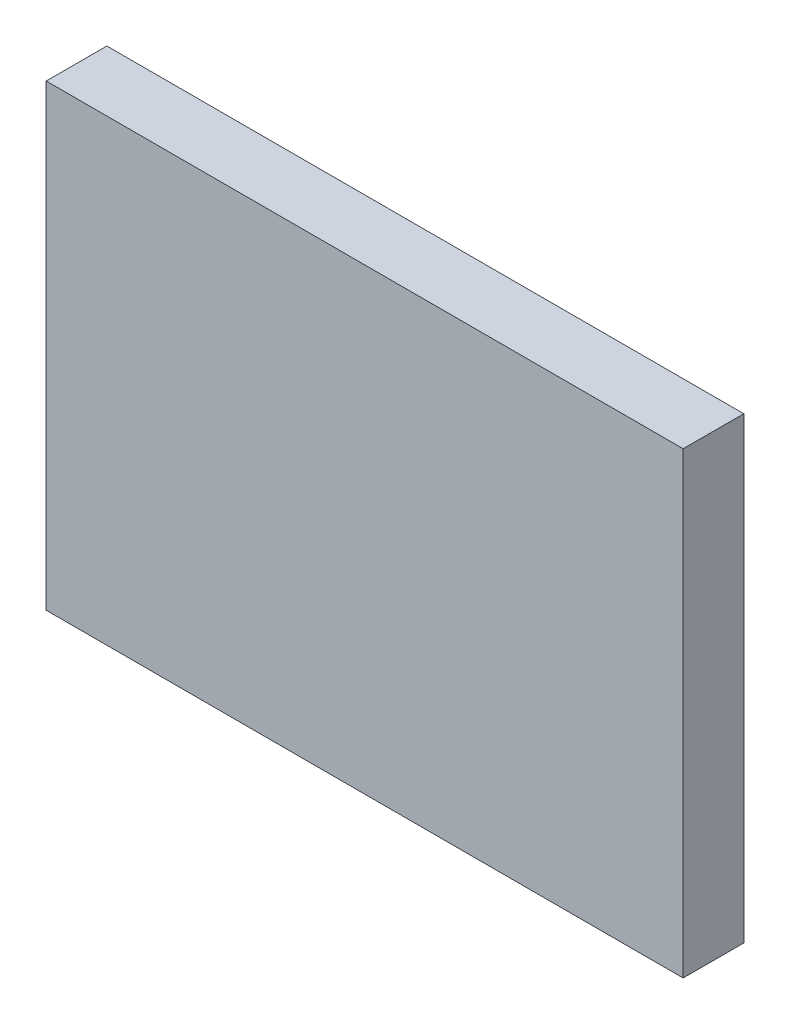
ISO-10303-21;
HEADER;
FILE_DESCRIPTION(('STEP AP214'),'2;1');
FILE_NAME('part.step','',(''),(''),'','','');
FILE_SCHEMA(('AUTOMOTIVE_DESIGN { 1 0 10303 214 1 1 1 1 }'));
ENDSEC;
DATA;
#1=APPLICATION_CONTEXT('core data for automotive mechanical design processes');
#2=APPLICATION_PROTOCOL_DEFINITION('international standard','automotive_design',2000,#1);
#3=PRODUCT_CONTEXT('',#1,'mechanical');
#4=PRODUCT('Part','Part','',(#3));
#5=PRODUCT_RELATED_PRODUCT_CATEGORY('part','',(#4));
#6=PRODUCT_DEFINITION_FORMATION('','',#4);
#7=PRODUCT_DEFINITION_CONTEXT('part definition',#1,'design');
#8=PRODUCT_DEFINITION('design','',#6,#7);
#9=PRODUCT_DEFINITION_SHAPE('','',#8);
#10=(LENGTH_UNIT() NAMED_UNIT(*) SI_UNIT(.MILLI.,.METRE.));
#11=(NAMED_UNIT(*) PLANE_ANGLE_UNIT() SI_UNIT($,.RADIAN.));
#12=(NAMED_UNIT(*) SI_UNIT($,.STERADIAN.) SOLID_ANGLE_UNIT());
#13=UNCERTAINTY_MEASURE_WITH_UNIT(LENGTH_MEASURE(1.E-05),#10,'distance_accuracy_value','');
#14=(GEOMETRIC_REPRESENTATION_CONTEXT(3) GLOBAL_UNCERTAINTY_ASSIGNED_CONTEXT((#13)) GLOBAL_UNIT_ASSIGNED_CONTEXT((#10,
#11,#12)) REPRESENTATION_CONTEXT('',''));
#15=CARTESIAN_POINT('',(0.,0.,0.));
#16=DIRECTION('',(0.,0.,1.));
#17=DIRECTION('',(1.,0.,0.));
#18=AXIS2_PLACEMENT_3D('',#15,#16,#17);
#19=CARTESIAN_POINT('',(0.,0.,6.35));
#20=DIRECTION('',(0.,1.,0.));
#21=DIRECTION('',(0.,0.,1.));
#22=AXIS2_PLACEMENT_3D('',#19,#20,#21);
#23=PLANE('',#22);
#24=DIRECTION('',(1.,0.,0.));
#25=VECTOR('',#24,1.);
#26=CARTESIAN_POINT('',(0.,0.,0.));
#27=LINE('',#26,#25);
#28=CARTESIAN_POINT('',(0.,0.,0.));
#29=VERTEX_POINT('',#28);
#30=CARTESIAN_POINT('',(66.7,0.,0.));
#31=VERTEX_POINT('',#30);
#32=EDGE_CURVE('E107',#29,#31,#27,.T.);
#33=ORIENTED_EDGE('',*,*,#32,.T.);
#34=DIRECTION('',(0.,0.,-1.));
#35=VECTOR('',#34,1.);
#36=CARTESIAN_POINT('',(66.7,0.,6.35));
#37=LINE('',#36,#35);
#38=CARTESIAN_POINT('',(66.7,0.,6.35));
#39=VERTEX_POINT('',#38);
#40=EDGE_CURVE('E11',#39,#31,#37,.T.);
#41=ORIENTED_EDGE('',*,*,#40,.F.);
#42=DIRECTION('',(1.,0.,0.));
#43=VECTOR('',#42,1.);
#44=CARTESIAN_POINT('',(0.,0.,6.35));
#45=LINE('',#44,#43);
#46=CARTESIAN_POINT('',(0.,0.,6.35));
#47=VERTEX_POINT('',#46);
#48=EDGE_CURVE('E91',#47,#39,#45,.T.);
#49=ORIENTED_EDGE('',*,*,#48,.F.);
#50=DIRECTION('',(0.,0.,-1.));
#51=VECTOR('',#50,1.);
#52=CARTESIAN_POINT('',(0.,0.,6.35));
#53=LINE('',#52,#51);
#54=EDGE_CURVE('E103',#47,#29,#53,.T.);
#55=ORIENTED_EDGE('',*,*,#54,.T.);
#56=EDGE_LOOP('',(#33,#41,#49,#55));
#57=FACE_BOUND('',#56,.T.);
#58=ADVANCED_FACE('F39',(#57),#23,.F.);
#59=CARTESIAN_POINT('',(66.7,0.,6.35));
#60=DIRECTION('',(-1.,0.,0.));
#61=DIRECTION('',(0.,0.,1.));
#62=AXIS2_PLACEMENT_3D('',#59,#60,#61);
#63=PLANE('',#62);
#64=DIRECTION('',(0.,1.,0.));
#65=VECTOR('',#64,1.);
#66=CARTESIAN_POINT('',(66.7,0.,0.));
#67=LINE('',#66,#65);
#68=CARTESIAN_POINT('',(66.7,48.,0.));
#69=VERTEX_POINT('',#68);
#70=EDGE_CURVE('E96',#31,#69,#67,.T.);
#71=ORIENTED_EDGE('',*,*,#70,.T.);
#72=DIRECTION('',(0.,0.,-1.));
#73=VECTOR('',#72,1.);
#74=CARTESIAN_POINT('',(66.7,48.,6.35));
#75=LINE('',#74,#73);
#76=CARTESIAN_POINT('',(66.7,48.,6.35));
#77=VERTEX_POINT('',#76);
#78=EDGE_CURVE('E48',#77,#69,#75,.T.);
#79=ORIENTED_EDGE('',*,*,#78,.F.);
#80=DIRECTION('',(0.,1.,0.));
#81=VECTOR('',#80,1.);
#82=CARTESIAN_POINT('',(66.7,0.,6.35));
#83=LINE('',#82,#81);
#84=EDGE_CURVE('E86',#39,#77,#83,.T.);
#85=ORIENTED_EDGE('',*,*,#84,.F.);
#86=ORIENTED_EDGE('',*,*,#40,.T.);
#87=EDGE_LOOP('',(#71,#79,#85,#86));
#88=FACE_BOUND('',#87,.T.);
#89=ADVANCED_FACE('F95',(#88),#63,.F.);
#90=CARTESIAN_POINT('',(66.7,48.,6.35));
#91=DIRECTION('',(0.,-1.,0.));
#92=DIRECTION('',(0.,0.,-1.));
#93=AXIS2_PLACEMENT_3D('',#90,#91,#92);
#94=PLANE('',#93);
#95=DIRECTION('',(-1.,0.,0.));
#96=VECTOR('',#95,1.);
#97=CARTESIAN_POINT('',(66.7,48.,0.));
#98=LINE('',#97,#96);
#99=CARTESIAN_POINT('',(0.,48.,0.));
#100=VERTEX_POINT('',#99);
#101=EDGE_CURVE('E73',#69,#100,#98,.T.);
#102=ORIENTED_EDGE('',*,*,#101,.T.);
#103=DIRECTION('',(0.,0.,-1.));
#104=VECTOR('',#103,1.);
#105=CARTESIAN_POINT('',(0.,48.,6.35));
#106=LINE('',#105,#104);
#107=CARTESIAN_POINT('',(0.,48.,6.35));
#108=VERTEX_POINT('',#107);
#109=EDGE_CURVE('E98',#108,#100,#106,.T.);
#110=ORIENTED_EDGE('',*,*,#109,.F.);
#111=DIRECTION('',(-1.,0.,0.));
#112=VECTOR('',#111,1.);
#113=CARTESIAN_POINT('',(66.7,48.,6.35));
#114=LINE('',#113,#112);
#115=EDGE_CURVE('E89',#77,#108,#114,.T.);
#116=ORIENTED_EDGE('',*,*,#115,.F.);
#117=ORIENTED_EDGE('',*,*,#78,.T.);
#118=EDGE_LOOP('',(#102,#110,#116,#117));
#119=FACE_BOUND('',#118,.T.);
#120=ADVANCED_FACE('F99',(#119),#94,.F.);
#121=CARTESIAN_POINT('',(0.,48.,6.35));
#122=DIRECTION('',(1.,0.,0.));
#123=DIRECTION('',(0.,0.,-1.));
#124=AXIS2_PLACEMENT_3D('',#121,#122,#123);
#125=PLANE('',#124);
#126=DIRECTION('',(0.,-1.,0.));
#127=VECTOR('',#126,1.);
#128=CARTESIAN_POINT('',(0.,48.,0.));
#129=LINE('',#128,#127);
#130=EDGE_CURVE('E79',#100,#29,#129,.T.);
#131=ORIENTED_EDGE('',*,*,#130,.T.);
#132=ORIENTED_EDGE('',*,*,#54,.F.);
#133=DIRECTION('',(0.,-1.,0.));
#134=VECTOR('',#133,1.);
#135=CARTESIAN_POINT('',(0.,48.,6.35));
#136=LINE('',#135,#134);
#137=EDGE_CURVE('E56',#108,#47,#136,.T.);
#138=ORIENTED_EDGE('',*,*,#137,.F.);
#139=ORIENTED_EDGE('',*,*,#109,.T.);
#140=EDGE_LOOP('',(#131,#132,#138,#139));
#141=FACE_BOUND('',#140,.T.);
#142=ADVANCED_FACE('F120',(#141),#125,.F.);
#143=CARTESIAN_POINT('',(0.,0.,6.35));
#144=DIRECTION('',(0.,0.,1.));
#145=DIRECTION('',(1.,0.,0.));
#146=AXIS2_PLACEMENT_3D('',#143,#144,#145);
#147=PLANE('',#146);
#148=ORIENTED_EDGE('',*,*,#48,.T.);
#149=ORIENTED_EDGE('',*,*,#84,.T.);
#150=ORIENTED_EDGE('',*,*,#115,.T.);
#151=ORIENTED_EDGE('',*,*,#137,.T.);
#152=EDGE_LOOP('',(#148,#149,#150,#151));
#153=FACE_BOUND('',#152,.T.);
#154=ADVANCED_FACE('F87',(#153),#147,.T.);
#155=CARTESIAN_POINT('',(0.,0.,0.));
#156=DIRECTION('',(0.,0.,1.));
#157=DIRECTION('',(1.,0.,0.));
#158=AXIS2_PLACEMENT_3D('',#155,#156,#157);
#159=PLANE('',#158);
#160=ORIENTED_EDGE('',*,*,#32,.F.);
#161=ORIENTED_EDGE('',*,*,#130,.F.);
#162=ORIENTED_EDGE('',*,*,#101,.F.);
#163=ORIENTED_EDGE('',*,*,#70,.F.);
#164=EDGE_LOOP('',(#160,#161,#162,#163));
#165=FACE_BOUND('',#164,.T.);
#166=ADVANCED_FACE('F123',(#165),#159,.F.);
#167=CLOSED_SHELL('',(#58,#89,#120,#142,#154,#166));
#168=MANIFOLD_SOLID_BREP('B2',#167);
#169=ADVANCED_BREP_SHAPE_REPRESENTATION('',(#18,#168),#14);
#170=SHAPE_DEFINITION_REPRESENTATION(#9,#169);
ENDSEC;
END-ISO-10303-21;
